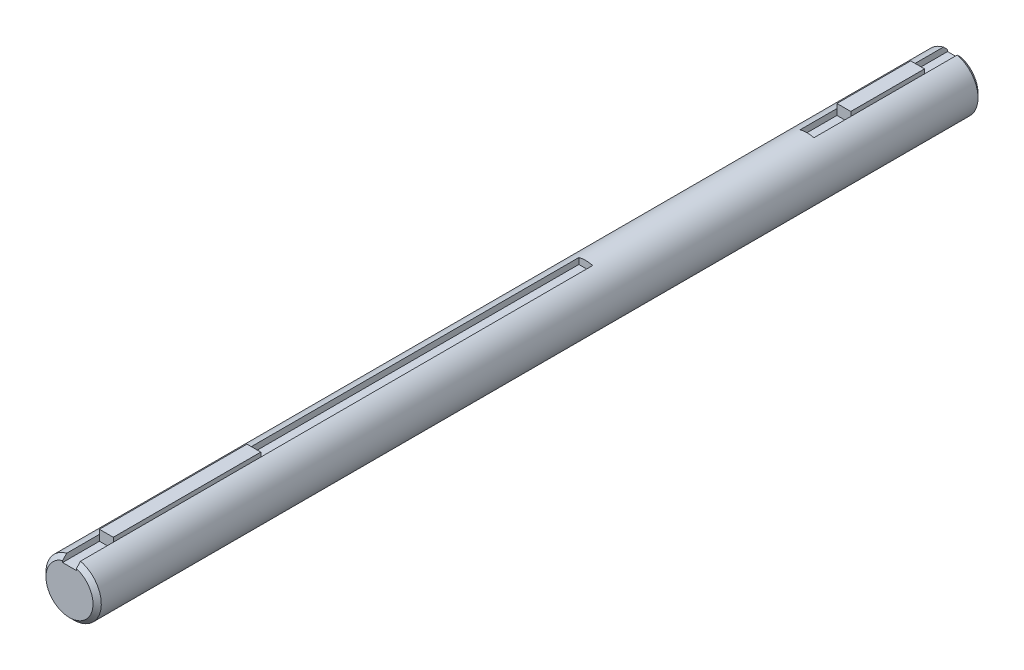
ISO-10303-21;
HEADER;
FILE_DESCRIPTION(('STEP AP214'),'2;1');
FILE_NAME('part.step','',(''),(''),'','','');
FILE_SCHEMA(('AUTOMOTIVE_DESIGN { 1 0 10303 214 1 1 1 1 }'));
ENDSEC;
DATA;
#1=APPLICATION_CONTEXT('core data for automotive mechanical design processes');
#2=APPLICATION_PROTOCOL_DEFINITION('international standard','automotive_design',2000,#1);
#3=PRODUCT_CONTEXT('',#1,'mechanical');
#4=PRODUCT('Part','Part','',(#3));
#5=PRODUCT_RELATED_PRODUCT_CATEGORY('part','',(#4));
#6=PRODUCT_DEFINITION_FORMATION('','',#4);
#7=PRODUCT_DEFINITION_CONTEXT('part definition',#1,'design');
#8=PRODUCT_DEFINITION('design','',#6,#7);
#9=PRODUCT_DEFINITION_SHAPE('','',#8);
#10=(LENGTH_UNIT() NAMED_UNIT(*) SI_UNIT(.MILLI.,.METRE.));
#11=(NAMED_UNIT(*) PLANE_ANGLE_UNIT() SI_UNIT($,.RADIAN.));
#12=(NAMED_UNIT(*) SI_UNIT($,.STERADIAN.) SOLID_ANGLE_UNIT());
#13=UNCERTAINTY_MEASURE_WITH_UNIT(LENGTH_MEASURE(1.E-05),#10,'distance_accuracy_value','');
#14=(GEOMETRIC_REPRESENTATION_CONTEXT(3) GLOBAL_UNCERTAINTY_ASSIGNED_CONTEXT((#13)) GLOBAL_UNIT_ASSIGNED_CONTEXT((#10,
#11,#12)) REPRESENTATION_CONTEXT('',''));
#15=CARTESIAN_POINT('',(0.,0.,0.));
#16=DIRECTION('',(0.,0.,1.));
#17=DIRECTION('',(1.,0.,0.));
#18=AXIS2_PLACEMENT_3D('',#15,#16,#17);
#19=CARTESIAN_POINT('',(-4.7625,14.2875,-279.4));
#20=DIRECTION('',(1.,0.,0.));
#21=DIRECTION('',(0.,0.,-1.));
#22=AXIS2_PLACEMENT_3D('',#19,#20,#21);
#23=PLANE('',#22);
#24=DIRECTION('',(0.,1.,0.));
#25=VECTOR('',#24,1.);
#26=CARTESIAN_POINT('',(-4.7625,14.2875,-228.6));
#27=LINE('',#26,#25);
#28=CARTESIAN_POINT('',(-4.7625,14.2875,-228.6));
#29=VERTEX_POINT('',#28);
#30=CARTESIAN_POINT('',(-4.7625,21.43125,-228.6));
#31=VERTEX_POINT('',#30);
#32=EDGE_CURVE('E105',#29,#31,#27,.T.);
#33=ORIENTED_EDGE('',*,*,#32,.T.);
#34=DIRECTION('',(0.,0.,1.));
#35=VECTOR('',#34,1.);
#36=CARTESIAN_POINT('',(-4.7625,21.43125,-279.4));
#37=LINE('',#36,#35);
#38=CARTESIAN_POINT('',(-4.7625,21.43125,-279.4));
#39=VERTEX_POINT('',#38);
#40=EDGE_CURVE('E12',#39,#31,#37,.T.);
#41=ORIENTED_EDGE('',*,*,#40,.F.);
#42=DIRECTION('',(0.,1.,0.));
#43=VECTOR('',#42,1.);
#44=CARTESIAN_POINT('',(-4.7625,14.2875,-279.4));
#45=LINE('',#44,#43);
#46=CARTESIAN_POINT('',(-4.7625,14.2875,-279.4));
#47=VERTEX_POINT('',#46);
#48=EDGE_CURVE('E93',#47,#39,#45,.T.);
#49=ORIENTED_EDGE('',*,*,#48,.F.);
#50=DIRECTION('',(0.,0.,1.));
#51=VECTOR('',#50,1.);
#52=CARTESIAN_POINT('',(-4.7625,14.2875,-279.4));
#53=LINE('',#52,#51);
#54=EDGE_CURVE('E101',#47,#29,#53,.T.);
#55=ORIENTED_EDGE('',*,*,#54,.T.);
#56=EDGE_LOOP('',(#33,#41,#49,#55));
#57=FACE_BOUND('',#56,.T.);
#58=ADVANCED_FACE('F42',(#57),#23,.F.);
#59=CARTESIAN_POINT('',(-4.7625,21.43125,-279.4));
#60=DIRECTION('',(0.,-1.,0.));
#61=DIRECTION('',(1.,0.,0.));
#62=AXIS2_PLACEMENT_3D('',#59,#60,#61);
#63=PLANE('',#62);
#64=DIRECTION('',(1.,0.,0.));
#65=VECTOR('',#64,1.);
#66=CARTESIAN_POINT('',(-4.7625,21.43125,-228.6));
#67=LINE('',#66,#65);
#68=CARTESIAN_POINT('',(4.7625,21.43125,-228.6));
#69=VERTEX_POINT('',#68);
#70=EDGE_CURVE('E97',#31,#69,#67,.T.);
#71=ORIENTED_EDGE('',*,*,#70,.T.);
#72=DIRECTION('',(0.,0.,1.));
#73=VECTOR('',#72,1.);
#74=CARTESIAN_POINT('',(4.7625,21.43125,-279.4));
#75=LINE('',#74,#73);
#76=CARTESIAN_POINT('',(4.7625,21.43125,-279.4));
#77=VERTEX_POINT('',#76);
#78=EDGE_CURVE('E50',#77,#69,#75,.T.);
#79=ORIENTED_EDGE('',*,*,#78,.F.);
#80=DIRECTION('',(1.,0.,0.));
#81=VECTOR('',#80,1.);
#82=CARTESIAN_POINT('',(-4.7625,21.43125,-279.4));
#83=LINE('',#82,#81);
#84=EDGE_CURVE('E88',#39,#77,#83,.T.);
#85=ORIENTED_EDGE('',*,*,#84,.F.);
#86=ORIENTED_EDGE('',*,*,#40,.T.);
#87=EDGE_LOOP('',(#71,#79,#85,#86));
#88=FACE_BOUND('',#87,.T.);
#89=ADVANCED_FACE('F96',(#88),#63,.F.);
#90=CARTESIAN_POINT('',(4.7625,21.43125,-279.4));
#91=DIRECTION('',(-1.,0.,0.));
#92=DIRECTION('',(0.,-1.,0.));
#93=AXIS2_PLACEMENT_3D('',#90,#91,#92);
#94=PLANE('',#93);
#95=DIRECTION('',(0.,-1.,0.));
#96=VECTOR('',#95,1.);
#97=CARTESIAN_POINT('',(4.7625,21.43125,-228.6));
#98=LINE('',#97,#96);
#99=CARTESIAN_POINT('',(4.7625,14.2875,-228.6));
#100=VERTEX_POINT('',#99);
#101=EDGE_CURVE('E75',#69,#100,#98,.T.);
#102=ORIENTED_EDGE('',*,*,#101,.T.);
#103=DIRECTION('',(0.,0.,1.));
#104=VECTOR('',#103,1.);
#105=CARTESIAN_POINT('',(4.7625,14.2875,-279.4));
#106=LINE('',#105,#104);
#107=CARTESIAN_POINT('',(4.7625,14.2875,-279.4));
#108=VERTEX_POINT('',#107);
#109=EDGE_CURVE('E98',#108,#100,#106,.T.);
#110=ORIENTED_EDGE('',*,*,#109,.F.);
#111=DIRECTION('',(0.,-1.,0.));
#112=VECTOR('',#111,1.);
#113=CARTESIAN_POINT('',(4.7625,21.43125,-279.4));
#114=LINE('',#113,#112);
#115=EDGE_CURVE('E91',#77,#108,#114,.T.);
#116=ORIENTED_EDGE('',*,*,#115,.F.);
#117=ORIENTED_EDGE('',*,*,#78,.T.);
#118=EDGE_LOOP('',(#102,#110,#116,#117));
#119=FACE_BOUND('',#118,.T.);
#120=ADVANCED_FACE('F99',(#119),#94,.F.);
#121=CARTESIAN_POINT('',(4.7625,14.2875,-279.4));
#122=DIRECTION('',(0.,1.,0.));
#123=DIRECTION('',(0.,0.,1.));
#124=AXIS2_PLACEMENT_3D('',#121,#122,#123);
#125=PLANE('',#124);
#126=DIRECTION('',(-1.,0.,0.));
#127=VECTOR('',#126,1.);
#128=CARTESIAN_POINT('',(4.7625,14.2875,-228.6));
#129=LINE('',#128,#127);
#130=EDGE_CURVE('E81',#100,#29,#129,.T.);
#131=ORIENTED_EDGE('',*,*,#130,.T.);
#132=ORIENTED_EDGE('',*,*,#54,.F.);
#133=DIRECTION('',(-1.,0.,0.));
#134=VECTOR('',#133,1.);
#135=CARTESIAN_POINT('',(4.7625,14.2875,-279.4));
#136=LINE('',#135,#134);
#137=EDGE_CURVE('E58',#108,#47,#136,.T.);
#138=ORIENTED_EDGE('',*,*,#137,.F.);
#139=ORIENTED_EDGE('',*,*,#109,.T.);
#140=EDGE_LOOP('',(#131,#132,#138,#139));
#141=FACE_BOUND('',#140,.T.);
#142=ADVANCED_FACE('F112',(#141),#125,.F.);
#143=CARTESIAN_POINT('',(-4.7625,21.43125,-279.4));
#144=DIRECTION('',(0.,0.,-1.));
#145=DIRECTION('',(-1.,0.,0.));
#146=AXIS2_PLACEMENT_3D('',#143,#144,#145);
#147=PLANE('',#146);
#148=ORIENTED_EDGE('',*,*,#48,.T.);
#149=ORIENTED_EDGE('',*,*,#84,.T.);
#150=ORIENTED_EDGE('',*,*,#115,.T.);
#151=ORIENTED_EDGE('',*,*,#137,.T.);
#152=EDGE_LOOP('',(#148,#149,#150,#151));
#153=FACE_BOUND('',#152,.T.);
#154=ADVANCED_FACE('F89',(#153),#147,.T.);
#155=CARTESIAN_POINT('',(-4.7625,21.43125,-228.6));
#156=DIRECTION('',(0.,0.,-1.));
#157=DIRECTION('',(-1.,0.,0.));
#158=AXIS2_PLACEMENT_3D('',#155,#156,#157);
#159=PLANE('',#158);
#160=ORIENTED_EDGE('',*,*,#32,.F.);
#161=ORIENTED_EDGE('',*,*,#130,.F.);
#162=ORIENTED_EDGE('',*,*,#101,.F.);
#163=ORIENTED_EDGE('',*,*,#70,.F.);
#164=EDGE_LOOP('',(#160,#161,#162,#163));
#165=FACE_BOUND('',#164,.T.);
#166=ADVANCED_FACE('F115',(#165),#159,.F.);
#167=CLOSED_SHELL('',(#58,#89,#120,#142,#154,#166));
#168=MANIFOLD_SOLID_BREP('B2',#167);
#169=CARTESIAN_POINT('',(-4.7625,21.43125,279.4));
#170=DIRECTION('',(1.,0.,0.));
#171=DIRECTION('',(0.,0.,-1.));
#172=AXIS2_PLACEMENT_3D('',#169,#170,#171);
#173=PLANE('',#172);
#174=DIRECTION('',(0.,-1.,0.));
#175=VECTOR('',#174,1.);
#176=CARTESIAN_POINT('',(-4.7625,21.43125,177.8));
#177=LINE('',#176,#175);
#178=CARTESIAN_POINT('',(-4.7625,21.43125,177.8));
#179=VERTEX_POINT('',#178);
#180=CARTESIAN_POINT('',(-4.7625,14.2875,177.8));
#181=VERTEX_POINT('',#180);
#182=EDGE_CURVE('E239',#179,#181,#177,.T.);
#183=ORIENTED_EDGE('',*,*,#182,.T.);
#184=DIRECTION('',(0.,0.,-1.));
#185=VECTOR('',#184,1.);
#186=CARTESIAN_POINT('',(-4.7625,14.2875,279.4));
#187=LINE('',#186,#185);
#188=CARTESIAN_POINT('',(-4.7625,14.2875,279.4));
#189=VERTEX_POINT('',#188);
#190=EDGE_CURVE('E40',#189,#181,#187,.T.);
#191=ORIENTED_EDGE('',*,*,#190,.F.);
#192=DIRECTION('',(0.,-1.,0.));
#193=VECTOR('',#192,1.);
#194=CARTESIAN_POINT('',(-4.7625,21.43125,279.4));
#195=LINE('',#194,#193);
#196=CARTESIAN_POINT('',(-4.7625,21.43125,279.4));
#197=VERTEX_POINT('',#196);
#198=EDGE_CURVE('E227',#197,#189,#195,.T.);
#199=ORIENTED_EDGE('',*,*,#198,.F.);
#200=DIRECTION('',(0.,0.,-1.));
#201=VECTOR('',#200,1.);
#202=CARTESIAN_POINT('',(-4.7625,21.43125,279.4));
#203=LINE('',#202,#201);
#204=EDGE_CURVE('E235',#197,#179,#203,.T.);
#205=ORIENTED_EDGE('',*,*,#204,.T.);
#206=EDGE_LOOP('',(#183,#191,#199,#205));
#207=FACE_BOUND('',#206,.T.);
#208=ADVANCED_FACE('F176',(#207),#173,.F.);
#209=CARTESIAN_POINT('',(-4.7625,14.2875,279.4));
#210=DIRECTION('',(0.,1.,0.));
#211=DIRECTION('',(0.,0.,1.));
#212=AXIS2_PLACEMENT_3D('',#209,#210,#211);
#213=PLANE('',#212);
#214=DIRECTION('',(1.,0.,0.));
#215=VECTOR('',#214,1.);
#216=CARTESIAN_POINT('',(-4.7625,14.2875,177.8));
#217=LINE('',#216,#215);
#218=CARTESIAN_POINT('',(4.7625,14.2875,177.8));
#219=VERTEX_POINT('',#218);
#220=EDGE_CURVE('E231',#181,#219,#217,.T.);
#221=ORIENTED_EDGE('',*,*,#220,.T.);
#222=DIRECTION('',(0.,0.,-1.));
#223=VECTOR('',#222,1.);
#224=CARTESIAN_POINT('',(4.7625,14.2875,279.4));
#225=LINE('',#224,#223);
#226=CARTESIAN_POINT('',(4.7625,14.2875,279.4));
#227=VERTEX_POINT('',#226);
#228=EDGE_CURVE('E184',#227,#219,#225,.T.);
#229=ORIENTED_EDGE('',*,*,#228,.F.);
#230=DIRECTION('',(1.,0.,0.));
#231=VECTOR('',#230,1.);
#232=CARTESIAN_POINT('',(-4.7625,14.2875,279.4));
#233=LINE('',#232,#231);
#234=EDGE_CURVE('E222',#189,#227,#233,.T.);
#235=ORIENTED_EDGE('',*,*,#234,.F.);
#236=ORIENTED_EDGE('',*,*,#190,.T.);
#237=EDGE_LOOP('',(#221,#229,#235,#236));
#238=FACE_BOUND('',#237,.T.);
#239=ADVANCED_FACE('F230',(#238),#213,.F.);
#240=CARTESIAN_POINT('',(4.7625,21.43125,279.4));
#241=DIRECTION('',(-1.,0.,0.));
#242=DIRECTION('',(0.,-1.,0.));
#243=AXIS2_PLACEMENT_3D('',#240,#241,#242);
#244=PLANE('',#243);
#245=DIRECTION('',(0.,1.,0.));
#246=VECTOR('',#245,1.);
#247=CARTESIAN_POINT('',(4.7625,21.43125,177.8));
#248=LINE('',#247,#246);
#249=CARTESIAN_POINT('',(4.7625,21.43125,177.8));
#250=VERTEX_POINT('',#249);
#251=EDGE_CURVE('E209',#219,#250,#248,.T.);
#252=ORIENTED_EDGE('',*,*,#251,.T.);
#253=DIRECTION('',(0.,0.,-1.));
#254=VECTOR('',#253,1.);
#255=CARTESIAN_POINT('',(4.7625,21.43125,279.4));
#256=LINE('',#255,#254);
#257=CARTESIAN_POINT('',(4.7625,21.43125,279.4));
#258=VERTEX_POINT('',#257);
#259=EDGE_CURVE('E232',#258,#250,#256,.T.);
#260=ORIENTED_EDGE('',*,*,#259,.F.);
#261=DIRECTION('',(0.,1.,0.));
#262=VECTOR('',#261,1.);
#263=CARTESIAN_POINT('',(4.7625,21.43125,279.4));
#264=LINE('',#263,#262);
#265=EDGE_CURVE('E225',#227,#258,#264,.T.);
#266=ORIENTED_EDGE('',*,*,#265,.F.);
#267=ORIENTED_EDGE('',*,*,#228,.T.);
#268=EDGE_LOOP('',(#252,#260,#266,#267));
#269=FACE_BOUND('',#268,.T.);
#270=ADVANCED_FACE('F233',(#269),#244,.F.);
#271=CARTESIAN_POINT('',(-4.7625,21.43125,279.4));
#272=DIRECTION('',(0.,-1.,0.));
#273=DIRECTION('',(1.,0.,0.));
#274=AXIS2_PLACEMENT_3D('',#271,#272,#273);
#275=PLANE('',#274);
#276=DIRECTION('',(-1.,0.,0.));
#277=VECTOR('',#276,1.);
#278=CARTESIAN_POINT('',(-4.7625,21.43125,177.8));
#279=LINE('',#278,#277);
#280=EDGE_CURVE('E215',#250,#179,#279,.T.);
#281=ORIENTED_EDGE('',*,*,#280,.T.);
#282=ORIENTED_EDGE('',*,*,#204,.F.);
#283=DIRECTION('',(-1.,0.,0.));
#284=VECTOR('',#283,1.);
#285=CARTESIAN_POINT('',(-4.7625,21.43125,279.4));
#286=LINE('',#285,#284);
#287=EDGE_CURVE('E192',#258,#197,#286,.T.);
#288=ORIENTED_EDGE('',*,*,#287,.F.);
#289=ORIENTED_EDGE('',*,*,#259,.T.);
#290=EDGE_LOOP('',(#281,#282,#288,#289));
#291=FACE_BOUND('',#290,.T.);
#292=ADVANCED_FACE('F246',(#291),#275,.F.);
#293=CARTESIAN_POINT('',(-4.7625,14.2875,279.4));
#294=DIRECTION('',(0.,0.,1.));
#295=DIRECTION('',(1.,0.,0.));
#296=AXIS2_PLACEMENT_3D('',#293,#294,#295);
#297=PLANE('',#296);
#298=ORIENTED_EDGE('',*,*,#198,.T.);
#299=ORIENTED_EDGE('',*,*,#234,.T.);
#300=ORIENTED_EDGE('',*,*,#265,.T.);
#301=ORIENTED_EDGE('',*,*,#287,.T.);
#302=EDGE_LOOP('',(#298,#299,#300,#301));
#303=FACE_BOUND('',#302,.T.);
#304=ADVANCED_FACE('F223',(#303),#297,.T.);
#305=CARTESIAN_POINT('',(-4.7625,14.2875,177.8));
#306=DIRECTION('',(0.,0.,1.));
#307=DIRECTION('',(1.,0.,0.));
#308=AXIS2_PLACEMENT_3D('',#305,#306,#307);
#309=PLANE('',#308);
#310=ORIENTED_EDGE('',*,*,#182,.F.);
#311=ORIENTED_EDGE('',*,*,#280,.F.);
#312=ORIENTED_EDGE('',*,*,#251,.F.);
#313=ORIENTED_EDGE('',*,*,#220,.F.);
#314=EDGE_LOOP('',(#310,#311,#312,#313));
#315=FACE_BOUND('',#314,.T.);
#316=ADVANCED_FACE('F249',(#315),#309,.F.);
#317=CLOSED_SHELL('',(#208,#239,#270,#292,#304,#316));
#318=MANIFOLD_SOLID_BREP('B6',#317);
#319=CARTESIAN_POINT('',(-4.7625,19.05,-304.8));
#320=DIRECTION('',(-1.,0.,0.));
#321=DIRECTION('',(0.,-1.,0.));
#322=AXIS2_PLACEMENT_3D('',#319,#320,#321);
#323=PLANE('',#322);
#324=DIRECTION('',(0.,1.,0.));
#325=VECTOR('',#324,1.);
#326=CARTESIAN_POINT('',(-4.7625,19.05,-203.2));
#327=LINE('',#326,#325);
#328=CARTESIAN_POINT('',(-4.7625,14.2875,-203.2));
#329=VERTEX_POINT('',#328);
#330=CARTESIAN_POINT('',(-4.7625,18.4450831863128,-203.2));
#331=VERTEX_POINT('',#330);
#332=EDGE_CURVE('E389',#329,#331,#327,.T.);
#333=ORIENTED_EDGE('',*,*,#332,.F.);
#334=DIRECTION('',(0.,0.,1.));
#335=VECTOR('',#334,1.);
#336=CARTESIAN_POINT('',(-4.7625,14.2875,-304.8));
#337=LINE('',#336,#335);
#338=CARTESIAN_POINT('',(-4.7625,14.2875,-304.8));
#339=VERTEX_POINT('',#338);
#340=EDGE_CURVE('E379',#339,#329,#337,.T.);
#341=ORIENTED_EDGE('',*,*,#340,.F.);
#342=DIRECTION('',(0.,-1.,0.));
#343=VECTOR('',#342,1.);
#344=CARTESIAN_POINT('',(-4.7625,19.05,-304.8));
#345=LINE('',#344,#343);
#346=CARTESIAN_POINT('',(-4.7625,15.4762931608311,-304.8));
#347=VERTEX_POINT('',#346);
#348=EDGE_CURVE('E493',#347,#339,#345,.T.);
#349=ORIENTED_EDGE('',*,*,#348,.F.);
#350=CARTESIAN_POINT('',(-4.7625,7.51406833625716,-312.096285680867));
#351=CARTESIAN_POINT('',(-4.7625,7.68702854068366,-311.950181648711));
#352=CARTESIAN_POINT('',(-4.7625,7.85928938308823,-311.803253933016));
#353=CARTESIAN_POINT('',(-4.7625,8.20258677422876,-311.507981296745));
#354=CARTESIAN_POINT('',(-4.7625,8.37362334696036,-311.359636404079));
#355=CARTESIAN_POINT('',(-4.7625,8.71464090977369,-311.061764737203));
#356=CARTESIAN_POINT('',(-4.7625,8.8846219763428,-310.912238050459));
#357=CARTESIAN_POINT('',(-4.7625,9.22367917455573,-310.612160893573));
#358=CARTESIAN_POINT('',(-4.7625,9.39275530107411,-310.461610417643));
#359=CARTESIAN_POINT('',(-4.7625,9.89874422184076,-310.008700201395));
#360=CARTESIAN_POINT('',(-4.7625,10.2344808282248,-309.705026212234));
#361=CARTESIAN_POINT('',(-4.7625,10.9035451074249,-309.095026829786));
#362=CARTESIAN_POINT('',(-4.7625,11.2368727270126,-308.788701378239));
#363=CARTESIAN_POINT('',(-4.7625,11.9015412384586,-308.174071985563));
#364=CARTESIAN_POINT('',(-4.7625,12.2328826111413,-307.865768564033));
#365=CARTESIAN_POINT('',(-4.7625,12.894040942004,-307.24753792318));
#366=CARTESIAN_POINT('',(-4.7625,13.2238579119962,-306.937610716478));
#367=CARTESIAN_POINT('',(-4.7625,13.8822738072202,-306.316430340605));
#368=CARTESIAN_POINT('',(-4.7625,14.2108726658294,-306.005177100853));
#369=CARTESIAN_POINT('',(-4.7625,14.8670522038403,-305.381598445328));
#370=CARTESIAN_POINT('',(-4.7625,15.1946328812362,-305.069273027445));
#371=CARTESIAN_POINT('',(-4.7625,16.1759271640393,-304.131153248613));
#372=CARTESIAN_POINT('',(-4.7625,16.8283791725782,-303.5040393077));
#373=CARTESIAN_POINT('',(-4.7625,18.1308725346506,-302.247345016921));
#374=CARTESIAN_POINT('',(-4.7625,18.7809139414571,-301.6177647222));
#375=CARTESIAN_POINT('',(-4.7625,20.0793618760806,-300.356653407936));
#376=CARTESIAN_POINT('',(-4.7625,20.7277680384229,-299.72512201228));
#377=CARTESIAN_POINT('',(-4.7625,22.0232225621981,-298.460644862527));
#378=CARTESIAN_POINT('',(-4.7625,22.6702708993322,-297.827699083531));
#379=CARTESIAN_POINT('',(-4.7625,23.3168347844345,-297.194260766505));
#380=B_SPLINE_CURVE_WITH_KNOTS('',3,(#350,#351,#352,#353,#354,#355,#356,#357,#358,#359,#360,
#361,#362,#363,#364,#365,#366,#367,#368,#369,#370,#371,#372,#373,#374,#375,#376,#377,#378,#379),
.UNSPECIFIED.,.F.,.F.,(4,2,2,2,2,2,2,2,2,2,2,2,2,2,4),(0.,0.679224335089674,1.35843532075878,
2.03759649907899,2.71676151998807,4.0748391641316,5.43294672480779,6.79071104422247,
8.1484648249374,9.50629180135504,10.8641214513113,13.5790121065689,16.2938424021231,
19.0092335282149,21.7246728395848),.UNSPECIFIED.);
#381=CARTESIAN_POINT('',(-4.7625,18.4450831863128,-301.942499999999));
#382=VERTEX_POINT('',#381);
#383=EDGE_CURVE('E422',#347,#382,#380,.T.);
#384=ORIENTED_EDGE('',*,*,#383,.T.);
#385=DIRECTION('',(0.,0.,-1.));
#386=VECTOR('',#385,1.);
#387=CARTESIAN_POINT('',(-4.7625,18.4450831863128,304.8));
#388=LINE('',#387,#386);
#389=EDGE_CURVE('E317',#331,#382,#388,.T.);
#390=ORIENTED_EDGE('',*,*,#389,.F.);
#391=EDGE_LOOP('',(#333,#341,#349,#384,#390));
#392=FACE_BOUND('',#391,.T.);
#393=ADVANCED_FACE('F301',(#392),#323,.F.);
#394=CARTESIAN_POINT('',(4.7625,19.05,-304.8));
#395=DIRECTION('',(1.,0.,0.));
#396=DIRECTION('',(0.,1.,0.));
#397=AXIS2_PLACEMENT_3D('',#394,#395,#396);
#398=PLANE('',#397);
#399=DIRECTION('',(0.,-1.,0.));
#400=VECTOR('',#399,1.);
#401=CARTESIAN_POINT('',(4.7625,19.05,-203.2));
#402=LINE('',#401,#400);
#403=CARTESIAN_POINT('',(4.7625,18.4450831863128,-203.2));
#404=VERTEX_POINT('',#403);
#405=CARTESIAN_POINT('',(4.7625,14.2875,-203.2));
#406=VERTEX_POINT('',#405);
#407=EDGE_CURVE('E394',#404,#406,#402,.T.);
#408=ORIENTED_EDGE('',*,*,#407,.F.);
#409=DIRECTION('',(0.,0.,-1.));
#410=VECTOR('',#409,1.);
#411=CARTESIAN_POINT('',(4.7625,18.4450831863128,304.8));
#412=LINE('',#411,#410);
#413=CARTESIAN_POINT('',(4.7625,18.4450831863128,-301.942499999999));
#414=VERTEX_POINT('',#413);
#415=EDGE_CURVE('E445',#414,#404,#412,.F.);
#416=ORIENTED_EDGE('',*,*,#415,.F.);
#417=CARTESIAN_POINT('',(4.7625,23.3168347844345,-297.194260766505));
#418=CARTESIAN_POINT('',(4.7625,22.6702708993322,-297.827699083531));
#419=CARTESIAN_POINT('',(4.7625,22.0232225621981,-298.460644862527));
#420=CARTESIAN_POINT('',(4.7625,20.7277680384229,-299.72512201228));
#421=CARTESIAN_POINT('',(4.7625,20.0793618760806,-300.356653407936));
#422=CARTESIAN_POINT('',(4.7625,18.7809139414571,-301.6177647222));
#423=CARTESIAN_POINT('',(4.7625,18.1308725346506,-302.247345016921));
#424=CARTESIAN_POINT('',(4.7625,16.8283791725782,-303.5040393077));
#425=CARTESIAN_POINT('',(4.7625,16.1759271640392,-304.131153248612));
#426=CARTESIAN_POINT('',(4.7625,15.1946328812362,-305.069273027445));
#427=CARTESIAN_POINT('',(4.7625,14.8670522038403,-305.381598445328));
#428=CARTESIAN_POINT('',(4.7625,14.2108726658294,-306.005177100853));
#429=CARTESIAN_POINT('',(4.7625,13.8822738072202,-306.316430340605));
#430=CARTESIAN_POINT('',(4.7625,13.2238579119962,-306.937610716478));
#431=CARTESIAN_POINT('',(4.7625,12.894040942004,-307.24753792318));
#432=CARTESIAN_POINT('',(4.7625,12.2328826111413,-307.865768564033));
#433=CARTESIAN_POINT('',(4.7625,11.9015412384587,-308.174071985563));
#434=CARTESIAN_POINT('',(4.7625,11.2368727270126,-308.788701378239));
#435=CARTESIAN_POINT('',(4.7625,10.9035451074248,-309.095026829786));
#436=CARTESIAN_POINT('',(4.7625,10.2344808282248,-309.705026212234));
#437=CARTESIAN_POINT('',(4.7625,9.89874422184075,-310.008700201395));
#438=CARTESIAN_POINT('',(4.7625,9.39275530107412,-310.461610417643));
#439=CARTESIAN_POINT('',(4.7625,9.22367917455573,-310.612160893573));
#440=CARTESIAN_POINT('',(4.7625,8.8846219763428,-310.912238050459));
#441=CARTESIAN_POINT('',(4.7625,8.71464090977369,-311.061764737203));
#442=CARTESIAN_POINT('',(4.7625,8.37362334696036,-311.359636404079));
#443=CARTESIAN_POINT('',(4.7625,8.20258677422876,-311.507981296745));
#444=CARTESIAN_POINT('',(4.7625,7.85928938308823,-311.803253933016));
#445=CARTESIAN_POINT('',(4.7625,7.68702854068366,-311.950181648711));
#446=CARTESIAN_POINT('',(4.7625,7.51406833625716,-312.096285680867));
#447=B_SPLINE_CURVE_WITH_KNOTS('',3,(#417,#418,#419,#420,#421,#422,#423,#424,#425,#426,#427,
#428,#429,#430,#431,#432,#433,#434,#435,#436,#437,#438,#439,#440,#441,#442,#443,#444,#445,#446),
.UNSPECIFIED.,.F.,.F.,(4,2,2,2,2,2,2,2,2,2,2,2,2,2,4),(0.,2.71543931136997,5.43083043746174,
8.14566073301589,10.8605513882735,12.2183810382298,13.5762080146474,14.9339617953624,
16.291726114777,17.6498336754533,19.0079113195968,19.6870763405058,20.3662375188261,
21.0454485044952,21.7246728395848),.UNSPECIFIED.);
#448=CARTESIAN_POINT('',(4.7625,15.4762931608311,-304.8));
#449=VERTEX_POINT('',#448);
#450=EDGE_CURVE('E440',#414,#449,#447,.T.);
#451=ORIENTED_EDGE('',*,*,#450,.T.);
#452=DIRECTION('',(0.,1.,0.));
#453=VECTOR('',#452,1.);
#454=CARTESIAN_POINT('',(4.7625,19.05,-304.8));
#455=LINE('',#454,#453);
#456=CARTESIAN_POINT('',(4.7625,14.2875,-304.8));
#457=VERTEX_POINT('',#456);
#458=EDGE_CURVE('E496',#457,#449,#455,.T.);
#459=ORIENTED_EDGE('',*,*,#458,.F.);
#460=DIRECTION('',(0.,0.,1.));
#461=VECTOR('',#460,1.);
#462=CARTESIAN_POINT('',(4.7625,14.2875,-304.8));
#463=LINE('',#462,#461);
#464=EDGE_CURVE('E470',#457,#406,#463,.T.);
#465=ORIENTED_EDGE('',*,*,#464,.T.);
#466=EDGE_LOOP('',(#408,#416,#451,#459,#465));
#467=FACE_BOUND('',#466,.T.);
#468=ADVANCED_FACE('F450',(#467),#398,.F.);
#469=CARTESIAN_POINT('',(-4.7625,14.2875,-304.8));
#470=DIRECTION('',(0.,-1.,0.));
#471=DIRECTION('',(0.,0.,-1.));
#472=AXIS2_PLACEMENT_3D('',#469,#470,#471);
#473=PLANE('',#472);
#474=DIRECTION('',(-1.,0.,0.));
#475=VECTOR('',#474,1.);
#476=CARTESIAN_POINT('',(-4.7625,14.2875,-203.2));
#477=LINE('',#476,#475);
#478=EDGE_CURVE('E310',#406,#329,#477,.T.);
#479=ORIENTED_EDGE('',*,*,#478,.F.);
#480=ORIENTED_EDGE('',*,*,#464,.F.);
#481=DIRECTION('',(1.,0.,0.));
#482=VECTOR('',#481,1.);
#483=CARTESIAN_POINT('',(-4.7625,14.2875,-304.8));
#484=LINE('',#483,#482);
#485=EDGE_CURVE('E384',#339,#457,#484,.T.);
#486=ORIENTED_EDGE('',*,*,#485,.F.);
#487=ORIENTED_EDGE('',*,*,#340,.T.);
#488=EDGE_LOOP('',(#479,#480,#486,#487));
#489=FACE_BOUND('',#488,.T.);
#490=ADVANCED_FACE('F380',(#489),#473,.F.);
#491=CARTESIAN_POINT('',(0.,0.,304.8));
#492=DIRECTION('',(0.,0.,-1.));
#493=DIRECTION('',(-1.,0.,0.));
#494=AXIS2_PLACEMENT_3D('',#491,#492,#493);
#495=CYLINDRICAL_SURFACE('',#494,19.05);
#496=CARTESIAN_POINT('',(-4.7625,18.4450831863128,301.9425));
#497=VERTEX_POINT('',#496);
#498=CARTESIAN_POINT('',(-4.7625,18.4450831863128,-50.7999999999998));
#499=VERTEX_POINT('',#498);
#500=EDGE_CURVE('E429',#497,#499,#388,.T.);
#501=ORIENTED_EDGE('',*,*,#500,.T.);
#502=CARTESIAN_POINT('',(0.,0.,-50.8));
#503=DIRECTION('',(0.,0.,1.));
#504=DIRECTION('',(1.,0.,0.));
#505=AXIS2_PLACEMENT_3D('',#502,#503,#504);
#506=CIRCLE('',#505,19.05);
#507=CARTESIAN_POINT('',(4.7625,18.4450831863128,-50.7999999999998));
#508=VERTEX_POINT('',#507);
#509=EDGE_CURVE('E471',#508,#499,#506,.T.);
#510=ORIENTED_EDGE('',*,*,#509,.F.);
#511=CARTESIAN_POINT('',(4.7625,18.4450831863128,301.9425));
#512=VERTEX_POINT('',#511);
#513=EDGE_CURVE('E478',#508,#512,#412,.F.);
#514=ORIENTED_EDGE('',*,*,#513,.T.);
#515=CARTESIAN_POINT('',(0.,0.,301.9425));
#516=DIRECTION('',(0.,0.,1.));
#517=DIRECTION('',(1.,0.,0.));
#518=AXIS2_PLACEMENT_3D('',#515,#516,#517);
#519=CIRCLE('',#518,19.05);
#520=EDGE_CURVE('E428',#512,#497,#519,.F.);
#521=ORIENTED_EDGE('',*,*,#520,.T.);
#522=EDGE_LOOP('',(#501,#510,#514,#521));
#523=FACE_BOUND('',#522,.T.);
#524=ORIENTED_EDGE('',*,*,#415,.T.);
#525=CARTESIAN_POINT('',(0.,0.,-203.2));
#526=DIRECTION('',(0.,0.,1.));
#527=DIRECTION('',(1.,0.,0.));
#528=AXIS2_PLACEMENT_3D('',#525,#526,#527);
#529=CIRCLE('',#528,19.05);
#530=EDGE_CURVE('E475',#331,#404,#529,.F.);
#531=ORIENTED_EDGE('',*,*,#530,.F.);
#532=ORIENTED_EDGE('',*,*,#389,.T.);
#533=CARTESIAN_POINT('',(0.,0.,-301.942499999999));
#534=DIRECTION('',(0.,0.,1.));
#535=DIRECTION('',(1.,0.,0.));
#536=AXIS2_PLACEMENT_3D('',#533,#534,#535);
#537=CIRCLE('',#536,19.05);
#538=EDGE_CURVE('E477',#382,#414,#537,.T.);
#539=ORIENTED_EDGE('',*,*,#538,.T.);
#540=EDGE_LOOP('',(#524,#531,#532,#539));
#541=FACE_BOUND('',#540,.T.);
#542=ADVANCED_FACE('F438',(#523,#541),#495,.T.);
#543=CARTESIAN_POINT('',(0.,0.,304.8));
#544=DIRECTION('',(0.,0.,1.));
#545=DIRECTION('',(1.,0.,0.));
#546=AXIS2_PLACEMENT_3D('',#543,#544,#545);
#547=PLANE('',#546);
#548=DIRECTION('',(0.,-1.,0.));
#549=VECTOR('',#548,1.);
#550=CARTESIAN_POINT('',(-4.7625,19.05,304.8));
#551=LINE('',#550,#549);
#552=CARTESIAN_POINT('',(-4.7625,15.4762931608317,304.8));
#553=VERTEX_POINT('',#552);
#554=CARTESIAN_POINT('',(-4.7625,14.2875,304.8));
#555=VERTEX_POINT('',#554);
#556=EDGE_CURVE('E485',#553,#555,#551,.T.);
#557=ORIENTED_EDGE('',*,*,#556,.F.);
#558=CARTESIAN_POINT('',(0.,0.,304.8));
#559=DIRECTION('',(0.,0.,1.));
#560=DIRECTION('',(1.,0.,0.));
#561=AXIS2_PLACEMENT_3D('',#558,#559,#560);
#562=CIRCLE('',#561,16.1925000000002);
#563=CARTESIAN_POINT('',(4.7625,15.4762931608317,304.8));
#564=VERTEX_POINT('',#563);
#565=EDGE_CURVE('E511',#553,#564,#562,.T.);
#566=ORIENTED_EDGE('',*,*,#565,.T.);
#567=DIRECTION('',(0.,1.,0.));
#568=VECTOR('',#567,1.);
#569=CARTESIAN_POINT('',(4.7625,19.05,304.8));
#570=LINE('',#569,#568);
#571=CARTESIAN_POINT('',(4.7625,14.2875,304.8));
#572=VERTEX_POINT('',#571);
#573=EDGE_CURVE('E491',#572,#564,#570,.T.);
#574=ORIENTED_EDGE('',*,*,#573,.F.);
#575=DIRECTION('',(1.,0.,0.));
#576=VECTOR('',#575,1.);
#577=CARTESIAN_POINT('',(-4.7625,14.2875,304.8));
#578=LINE('',#577,#576);
#579=EDGE_CURVE('E488',#555,#572,#578,.T.);
#580=ORIENTED_EDGE('',*,*,#579,.F.);
#581=EDGE_LOOP('',(#557,#566,#574,#580));
#582=FACE_BOUND('',#581,.T.);
#583=ADVANCED_FACE('F418',(#582),#547,.T.);
#584=CARTESIAN_POINT('',(0.,0.,-304.8));
#585=DIRECTION('',(0.,0.,1.));
#586=DIRECTION('',(1.,0.,0.));
#587=AXIS2_PLACEMENT_3D('',#584,#585,#586);
#588=PLANE('',#587);
#589=CARTESIAN_POINT('',(0.,0.,-304.8));
#590=DIRECTION('',(0.,0.,1.));
#591=DIRECTION('',(1.,0.,0.));
#592=AXIS2_PLACEMENT_3D('',#589,#590,#591);
#593=CIRCLE('',#592,16.1924999999996);
#594=EDGE_CURVE('E514',#449,#347,#593,.F.);
#595=ORIENTED_EDGE('',*,*,#594,.T.);
#596=ORIENTED_EDGE('',*,*,#348,.T.);
#597=ORIENTED_EDGE('',*,*,#485,.T.);
#598=ORIENTED_EDGE('',*,*,#458,.T.);
#599=EDGE_LOOP('',(#595,#596,#597,#598));
#600=FACE_BOUND('',#599,.T.);
#601=ADVANCED_FACE('F436',(#600),#588,.F.);
#602=CARTESIAN_POINT('',(0.,0.,-301.942499999999));
#603=DIRECTION('',(0.,0.,1.));
#604=DIRECTION('',(1.,0.,0.));
#605=AXIS2_PLACEMENT_3D('',#602,#603,#604);
#606=CONICAL_SURFACE('',#605,19.05,0.785398163397428);
#607=ORIENTED_EDGE('',*,*,#383,.F.);
#608=ORIENTED_EDGE('',*,*,#594,.F.);
#609=ORIENTED_EDGE('',*,*,#450,.F.);
#610=ORIENTED_EDGE('',*,*,#538,.F.);
#611=EDGE_LOOP('',(#607,#608,#609,#610));
#612=FACE_BOUND('',#611,.T.);
#613=ADVANCED_FACE('F432',(#612),#606,.T.);
#614=CARTESIAN_POINT('',(0.,0.,304.8));
#615=DIRECTION('',(0.,0.,-1.));
#616=DIRECTION('',(-1.,0.,0.));
#617=AXIS2_PLACEMENT_3D('',#614,#615,#616);
#618=CONICAL_SURFACE('',#617,16.1925000000002,0.785398163397447);
#619=CARTESIAN_POINT('',(-4.7625,23.3168347844346,297.194260766506));
#620=CARTESIAN_POINT('',(-4.7625,22.6702708993322,297.827699083532));
#621=CARTESIAN_POINT('',(-4.7625,22.0232225621981,298.460644862528));
#622=CARTESIAN_POINT('',(-4.7625,20.727768038423,299.725122012281));
#623=CARTESIAN_POINT('',(-4.7625,20.0793618760807,300.356653407937));
#624=CARTESIAN_POINT('',(-4.7625,18.7809139414572,301.6177647222));
#625=CARTESIAN_POINT('',(-4.7625,18.1308725346507,302.247345016921));
#626=CARTESIAN_POINT('',(-4.7625,16.8283791725784,303.5040393077));
#627=CARTESIAN_POINT('',(-4.7625,16.1759271640394,304.131153248613));
#628=CARTESIAN_POINT('',(-4.7625,15.1946328812363,305.069273027446));
#629=CARTESIAN_POINT('',(-4.7625,14.8670522038405,305.381598445329));
#630=CARTESIAN_POINT('',(-4.7625,14.2108726658296,306.005177100854));
#631=CARTESIAN_POINT('',(-4.7625,13.8822738072205,306.316430340606));
#632=CARTESIAN_POINT('',(-4.7625,13.2238579119965,306.937610716478));
#633=CARTESIAN_POINT('',(-4.7625,12.8940409420042,307.24753792318));
#634=CARTESIAN_POINT('',(-4.7625,12.2328826111415,307.865768564034));
#635=CARTESIAN_POINT('',(-4.7625,11.9015412384589,308.174071985563));
#636=CARTESIAN_POINT('',(-4.7625,11.2368727270128,308.788701378239));
#637=CARTESIAN_POINT('',(-4.7625,10.9035451074251,309.095026829786));
#638=CARTESIAN_POINT('',(-4.7625,10.2344808282251,309.705026212234));
#639=CARTESIAN_POINT('',(-4.7625,9.89874422184105,310.008700201395));
#640=CARTESIAN_POINT('',(-4.7625,9.3927553010744,310.461610417643));
#641=CARTESIAN_POINT('',(-4.7625,9.223679174556,310.612160893573));
#642=CARTESIAN_POINT('',(-4.7625,8.88462197634308,310.912238050459));
#643=CARTESIAN_POINT('',(-4.7625,8.71464090977399,311.061764737203));
#644=CARTESIAN_POINT('',(-4.7625,8.37362334696068,311.359636404079));
#645=CARTESIAN_POINT('',(-4.7625,8.20258677422907,311.507981296745));
#646=CARTESIAN_POINT('',(-4.7625,7.85928938308854,311.803253933016));
#647=CARTESIAN_POINT('',(-4.7625,7.68702854068399,311.950181648711));
#648=CARTESIAN_POINT('',(-4.7625,7.51406833625749,312.096285680867));
#649=B_SPLINE_CURVE_WITH_KNOTS('',3,(#619,#620,#621,#622,#623,#624,#625,#626,#627,#628,#629,
#630,#631,#632,#633,#634,#635,#636,#637,#638,#639,#640,#641,#642,#643,#644,#645,#646,#647,#648),
.UNSPECIFIED.,.F.,.F.,(4,2,2,2,2,2,2,2,2,2,2,2,2,2,4),(0.,2.71543931136989,5.43083043746153,
8.14566073301554,10.8605513882731,12.2183810382293,13.5762080146469,14.9339617953618,
16.2917261147764,17.6498336754526,19.007911319596,19.6870763405051,20.3662375188253,
21.0454485044944,21.724672839584),.UNSPECIFIED.);
#650=EDGE_CURVE('E398',#497,#553,#649,.T.);
#651=ORIENTED_EDGE('',*,*,#650,.F.);
#652=ORIENTED_EDGE('',*,*,#520,.F.);
#653=CARTESIAN_POINT('',(4.7625,7.51406833625749,312.096285680867));
#654=CARTESIAN_POINT('',(4.7625,7.68702854068399,311.950181648711));
#655=CARTESIAN_POINT('',(4.7625,7.85928938308854,311.803253933016));
#656=CARTESIAN_POINT('',(4.7625,8.20258677422907,311.507981296745));
#657=CARTESIAN_POINT('',(4.7625,8.37362334696068,311.359636404079));
#658=CARTESIAN_POINT('',(4.7625,8.71464090977399,311.061764737203));
#659=CARTESIAN_POINT('',(4.7625,8.88462197634309,310.912238050459));
#660=CARTESIAN_POINT('',(4.7625,9.223679174556,310.612160893573));
#661=CARTESIAN_POINT('',(4.7625,9.3927553010744,310.461610417643));
#662=CARTESIAN_POINT('',(4.7625,9.89874422184104,310.008700201395));
#663=CARTESIAN_POINT('',(4.7625,10.234480828225,309.705026212234));
#664=CARTESIAN_POINT('',(4.7625,10.9035451074251,309.095026829786));
#665=CARTESIAN_POINT('',(4.7625,11.2368727270128,308.788701378239));
#666=CARTESIAN_POINT('',(4.7625,11.9015412384589,308.174071985563));
#667=CARTESIAN_POINT('',(4.7625,12.2328826111415,307.865768564034));
#668=CARTESIAN_POINT('',(4.7625,12.8940409420042,307.24753792318));
#669=CARTESIAN_POINT('',(4.7625,13.2238579119965,306.937610716478));
#670=CARTESIAN_POINT('',(4.7625,13.8822738072205,306.316430340605));
#671=CARTESIAN_POINT('',(4.7625,14.2108726658296,306.005177100854));
#672=CARTESIAN_POINT('',(4.7625,14.8670522038406,305.381598445329));
#673=CARTESIAN_POINT('',(4.7625,15.1946328812364,305.069273027446));
#674=CARTESIAN_POINT('',(4.7625,16.1759271640394,304.131153248613));
#675=CARTESIAN_POINT('',(4.7625,16.8283791725784,303.5040393077));
#676=CARTESIAN_POINT('',(4.7625,18.1308725346507,302.247345016921));
#677=CARTESIAN_POINT('',(4.7625,18.7809139414572,301.6177647222));
#678=CARTESIAN_POINT('',(4.7625,20.0793618760807,300.356653407937));
#679=CARTESIAN_POINT('',(4.7625,20.727768038423,299.725122012281));
#680=CARTESIAN_POINT('',(4.7625,22.0232225621981,298.460644862528));
#681=CARTESIAN_POINT('',(4.7625,22.6702708993322,297.827699083532));
#682=CARTESIAN_POINT('',(4.7625,23.3168347844346,297.194260766506));
#683=B_SPLINE_CURVE_WITH_KNOTS('',3,(#653,#654,#655,#656,#657,#658,#659,#660,#661,#662,#663,
#664,#665,#666,#667,#668,#669,#670,#671,#672,#673,#674,#675,#676,#677,#678,#679,#680,#681,#682),
.UNSPECIFIED.,.F.,.F.,(4,2,2,2,2,2,2,2,2,2,2,2,2,2,4),(0.,0.679224335089616,1.35843532075873,
2.03759649907891,2.716761519988,4.07483916413141,5.43294672480762,6.79071104422232,
8.14846482493721,9.50629180135473,10.864121451311,13.5790121065685,16.2938424021225,
19.0092335282142,21.724672839584),.UNSPECIFIED.);
#684=EDGE_CURVE('E399',#564,#512,#683,.T.);
#685=ORIENTED_EDGE('',*,*,#684,.F.);
#686=ORIENTED_EDGE('',*,*,#565,.F.);
#687=EDGE_LOOP('',(#651,#652,#685,#686));
#688=FACE_BOUND('',#687,.T.);
#689=ADVANCED_FACE('F303',(#688),#618,.T.);
#690=CARTESIAN_POINT('',(-4.7625,14.2875,-50.8000000000001));
#691=VERTEX_POINT('',#690);
#692=EDGE_CURVE('E387',#691,#555,#337,.T.);
#693=ORIENTED_EDGE('',*,*,#692,.F.);
#694=DIRECTION('',(0.,1.,0.));
#695=VECTOR('',#694,1.);
#696=CARTESIAN_POINT('',(-4.7625,19.05,-50.8));
#697=LINE('',#696,#695);
#698=EDGE_CURVE('E325',#691,#499,#697,.T.);
#699=ORIENTED_EDGE('',*,*,#698,.T.);
#700=ORIENTED_EDGE('',*,*,#500,.F.);
#701=ORIENTED_EDGE('',*,*,#650,.T.);
#702=ORIENTED_EDGE('',*,*,#556,.T.);
#703=EDGE_LOOP('',(#693,#699,#700,#701,#702));
#704=FACE_BOUND('',#703,.T.);
#705=ADVANCED_FACE('F411',(#704),#323,.F.);
#706=ORIENTED_EDGE('',*,*,#513,.F.);
#707=DIRECTION('',(0.,-1.,0.));
#708=VECTOR('',#707,1.);
#709=CARTESIAN_POINT('',(4.7625,19.05,-50.8));
#710=LINE('',#709,#708);
#711=CARTESIAN_POINT('',(4.7625,14.2875,-50.8000000000001));
#712=VERTEX_POINT('',#711);
#713=EDGE_CURVE('E393',#508,#712,#710,.T.);
#714=ORIENTED_EDGE('',*,*,#713,.T.);
#715=EDGE_CURVE('E386',#712,#572,#463,.T.);
#716=ORIENTED_EDGE('',*,*,#715,.T.);
#717=ORIENTED_EDGE('',*,*,#573,.T.);
#718=ORIENTED_EDGE('',*,*,#684,.T.);
#719=EDGE_LOOP('',(#706,#714,#716,#717,#718));
#720=FACE_BOUND('',#719,.T.);
#721=ADVANCED_FACE('F416',(#720),#398,.F.);
#722=ORIENTED_EDGE('',*,*,#715,.F.);
#723=DIRECTION('',(-1.,0.,0.));
#724=VECTOR('',#723,1.);
#725=CARTESIAN_POINT('',(-4.7625,14.2875,-50.8));
#726=LINE('',#725,#724);
#727=EDGE_CURVE('E174',#712,#691,#726,.T.);
#728=ORIENTED_EDGE('',*,*,#727,.T.);
#729=ORIENTED_EDGE('',*,*,#692,.T.);
#730=ORIENTED_EDGE('',*,*,#579,.T.);
#731=EDGE_LOOP('',(#722,#728,#729,#730));
#732=FACE_BOUND('',#731,.T.);
#733=ADVANCED_FACE('F417',(#732),#473,.F.);
#734=CARTESIAN_POINT('',(0.,0.,-50.8));
#735=DIRECTION('',(0.,0.,1.));
#736=DIRECTION('',(1.,0.,0.));
#737=AXIS2_PLACEMENT_3D('',#734,#735,#736);
#738=PLANE('',#737);
#739=ORIENTED_EDGE('',*,*,#698,.F.);
#740=ORIENTED_EDGE('',*,*,#727,.F.);
#741=ORIENTED_EDGE('',*,*,#713,.F.);
#742=ORIENTED_EDGE('',*,*,#509,.T.);
#743=EDGE_LOOP('',(#739,#740,#741,#742));
#744=FACE_BOUND('',#743,.T.);
#745=ADVANCED_FACE('F451',(#744),#738,.T.);
#746=CARTESIAN_POINT('',(0.,0.,-203.2));
#747=DIRECTION('',(0.,0.,1.));
#748=DIRECTION('',(1.,0.,0.));
#749=AXIS2_PLACEMENT_3D('',#746,#747,#748);
#750=PLANE('',#749);
#751=ORIENTED_EDGE('',*,*,#478,.T.);
#752=ORIENTED_EDGE('',*,*,#332,.T.);
#753=ORIENTED_EDGE('',*,*,#530,.T.);
#754=ORIENTED_EDGE('',*,*,#407,.T.);
#755=EDGE_LOOP('',(#751,#752,#753,#754));
#756=FACE_BOUND('',#755,.T.);
#757=ADVANCED_FACE('F397',(#756),#750,.F.);
#758=CLOSED_SHELL('',(#393,#468,#490,#542,#583,#601,#613,#689,#705,#721,#733,#745,#757));
#759=MANIFOLD_SOLID_BREP('B34',#758);
#760=ADVANCED_BREP_SHAPE_REPRESENTATION('',(#18,#168,#318,#759),#14);
#761=SHAPE_DEFINITION_REPRESENTATION(#9,#760);
ENDSEC;
END-ISO-10303-21;
